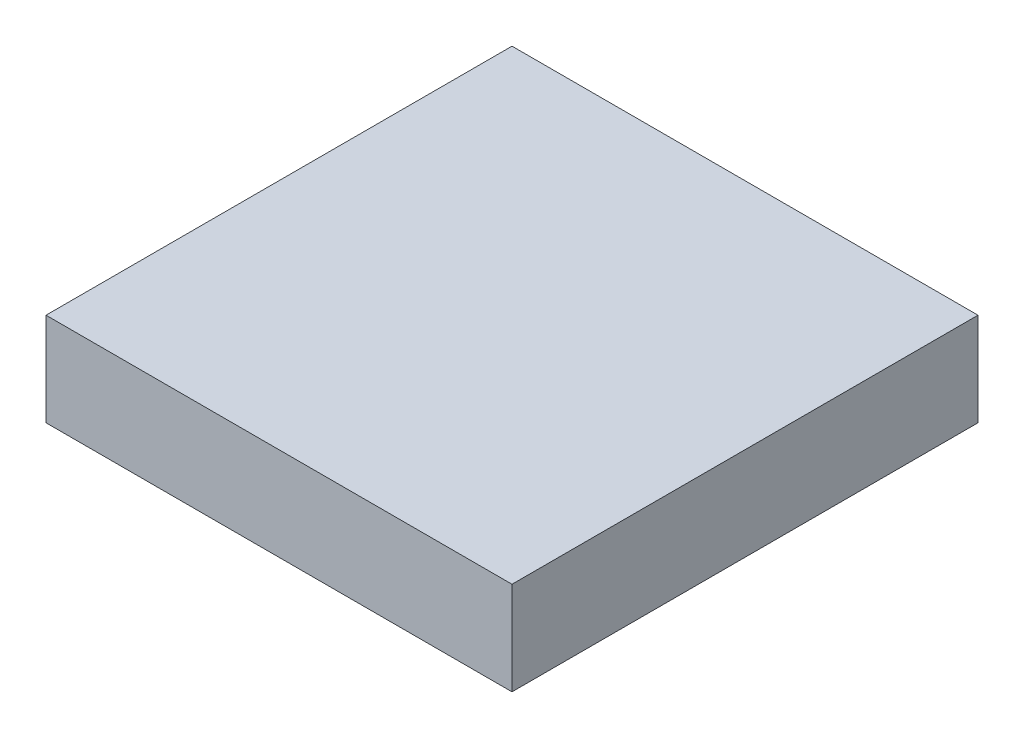
ISO-10303-21;
HEADER;
FILE_DESCRIPTION(('STEP AP214'),'2;1');
FILE_NAME('part.step','',(''),(''),'','','');
FILE_SCHEMA(('AUTOMOTIVE_DESIGN { 1 0 10303 214 1 1 1 1 }'));
ENDSEC;
DATA;
#1=APPLICATION_CONTEXT('core data for automotive mechanical design processes');
#2=APPLICATION_PROTOCOL_DEFINITION('international standard','automotive_design',2000,#1);
#3=PRODUCT_CONTEXT('',#1,'mechanical');
#4=PRODUCT('Part','Part','',(#3));
#5=PRODUCT_RELATED_PRODUCT_CATEGORY('part','',(#4));
#6=PRODUCT_DEFINITION_FORMATION('','',#4);
#7=PRODUCT_DEFINITION_CONTEXT('part definition',#1,'design');
#8=PRODUCT_DEFINITION('design','',#6,#7);
#9=PRODUCT_DEFINITION_SHAPE('','',#8);
#10=(LENGTH_UNIT() NAMED_UNIT(*) SI_UNIT(.MILLI.,.METRE.));
#11=(NAMED_UNIT(*) PLANE_ANGLE_UNIT() SI_UNIT($,.RADIAN.));
#12=(NAMED_UNIT(*) SI_UNIT($,.STERADIAN.) SOLID_ANGLE_UNIT());
#13=UNCERTAINTY_MEASURE_WITH_UNIT(LENGTH_MEASURE(1.E-05),#10,'distance_accuracy_value','');
#14=(GEOMETRIC_REPRESENTATION_CONTEXT(3) GLOBAL_UNCERTAINTY_ASSIGNED_CONTEXT((#13)) GLOBAL_UNIT_ASSIGNED_CONTEXT((#10,
#11,#12)) REPRESENTATION_CONTEXT('',''));
#15=CARTESIAN_POINT('',(0.,0.,0.));
#16=DIRECTION('',(0.,0.,1.));
#17=DIRECTION('',(1.,0.,0.));
#18=AXIS2_PLACEMENT_3D('',#15,#16,#17);
#19=CARTESIAN_POINT('',(10.,4.,10.));
#20=DIRECTION('',(-1.,0.,0.));
#21=DIRECTION('',(0.,0.,1.));
#22=AXIS2_PLACEMENT_3D('',#19,#20,#21);
#23=PLANE('',#22);
#24=DIRECTION('',(0.,0.,-1.));
#25=VECTOR('',#24,1.);
#26=CARTESIAN_POINT('',(10.,0.,10.));
#27=LINE('',#26,#25);
#28=CARTESIAN_POINT('',(10.,0.,10.));
#29=VERTEX_POINT('',#28);
#30=CARTESIAN_POINT('',(10.,0.,-10.));
#31=VERTEX_POINT('',#30);
#32=EDGE_CURVE('E98',#29,#31,#27,.T.);
#33=ORIENTED_EDGE('',*,*,#32,.T.);
#34=DIRECTION('',(0.,-1.,0.));
#35=VECTOR('',#34,1.);
#36=CARTESIAN_POINT('',(10.,4.,-10.));
#37=LINE('',#36,#35);
#38=CARTESIAN_POINT('',(10.,4.,-10.));
#39=VERTEX_POINT('',#38);
#40=EDGE_CURVE('E11',#39,#31,#37,.T.);
#41=ORIENTED_EDGE('',*,*,#40,.F.);
#42=DIRECTION('',(0.,0.,-1.));
#43=VECTOR('',#42,1.);
#44=CARTESIAN_POINT('',(10.,4.,10.));
#45=LINE('',#44,#43);
#46=CARTESIAN_POINT('',(10.,4.,10.));
#47=VERTEX_POINT('',#46);
#48=EDGE_CURVE('E86',#47,#39,#45,.T.);
#49=ORIENTED_EDGE('',*,*,#48,.F.);
#50=DIRECTION('',(0.,-1.,0.));
#51=VECTOR('',#50,1.);
#52=CARTESIAN_POINT('',(10.,4.,10.));
#53=LINE('',#52,#51);
#54=EDGE_CURVE('E94',#47,#29,#53,.T.);
#55=ORIENTED_EDGE('',*,*,#54,.T.);
#56=EDGE_LOOP('',(#33,#41,#49,#55));
#57=FACE_BOUND('',#56,.T.);
#58=ADVANCED_FACE('F35',(#57),#23,.F.);
#59=CARTESIAN_POINT('',(-10.,4.,-10.));
#60=DIRECTION('',(0.,0.,1.));
#61=DIRECTION('',(1.,0.,0.));
#62=AXIS2_PLACEMENT_3D('',#59,#60,#61);
#63=PLANE('',#62);
#64=DIRECTION('',(-1.,0.,0.));
#65=VECTOR('',#64,1.);
#66=CARTESIAN_POINT('',(-10.,0.,-10.));
#67=LINE('',#66,#65);
#68=CARTESIAN_POINT('',(-10.,0.,-10.));
#69=VERTEX_POINT('',#68);
#70=EDGE_CURVE('E90',#31,#69,#67,.T.);
#71=ORIENTED_EDGE('',*,*,#70,.T.);
#72=DIRECTION('',(0.,-1.,0.));
#73=VECTOR('',#72,1.);
#74=CARTESIAN_POINT('',(-10.,4.,-10.));
#75=LINE('',#74,#73);
#76=CARTESIAN_POINT('',(-10.,4.,-10.));
#77=VERTEX_POINT('',#76);
#78=EDGE_CURVE('E43',#77,#69,#75,.T.);
#79=ORIENTED_EDGE('',*,*,#78,.F.);
#80=DIRECTION('',(-1.,0.,0.));
#81=VECTOR('',#80,1.);
#82=CARTESIAN_POINT('',(-10.,4.,-10.));
#83=LINE('',#82,#81);
#84=EDGE_CURVE('E81',#39,#77,#83,.T.);
#85=ORIENTED_EDGE('',*,*,#84,.F.);
#86=ORIENTED_EDGE('',*,*,#40,.T.);
#87=EDGE_LOOP('',(#71,#79,#85,#86));
#88=FACE_BOUND('',#87,.T.);
#89=ADVANCED_FACE('F89',(#88),#63,.F.);
#90=CARTESIAN_POINT('',(-10.,4.,10.));
#91=DIRECTION('',(1.,0.,0.));
#92=DIRECTION('',(0.,0.,-1.));
#93=AXIS2_PLACEMENT_3D('',#90,#91,#92);
#94=PLANE('',#93);
#95=DIRECTION('',(0.,0.,1.));
#96=VECTOR('',#95,1.);
#97=CARTESIAN_POINT('',(-10.,0.,10.));
#98=LINE('',#97,#96);
#99=CARTESIAN_POINT('',(-10.,0.,10.));
#100=VERTEX_POINT('',#99);
#101=EDGE_CURVE('E68',#69,#100,#98,.T.);
#102=ORIENTED_EDGE('',*,*,#101,.T.);
#103=DIRECTION('',(0.,-1.,0.));
#104=VECTOR('',#103,1.);
#105=CARTESIAN_POINT('',(-10.,4.,10.));
#106=LINE('',#105,#104);
#107=CARTESIAN_POINT('',(-10.,4.,10.));
#108=VERTEX_POINT('',#107);
#109=EDGE_CURVE('E91',#108,#100,#106,.T.);
#110=ORIENTED_EDGE('',*,*,#109,.F.);
#111=DIRECTION('',(0.,0.,1.));
#112=VECTOR('',#111,1.);
#113=CARTESIAN_POINT('',(-10.,4.,10.));
#114=LINE('',#113,#112);
#115=EDGE_CURVE('E84',#77,#108,#114,.T.);
#116=ORIENTED_EDGE('',*,*,#115,.F.);
#117=ORIENTED_EDGE('',*,*,#78,.T.);
#118=EDGE_LOOP('',(#102,#110,#116,#117));
#119=FACE_BOUND('',#118,.T.);
#120=ADVANCED_FACE('F92',(#119),#94,.F.);
#121=CARTESIAN_POINT('',(-10.,4.,10.));
#122=DIRECTION('',(0.,0.,-1.));
#123=DIRECTION('',(-1.,0.,0.));
#124=AXIS2_PLACEMENT_3D('',#121,#122,#123);
#125=PLANE('',#124);
#126=DIRECTION('',(1.,0.,0.));
#127=VECTOR('',#126,1.);
#128=CARTESIAN_POINT('',(-10.,0.,10.));
#129=LINE('',#128,#127);
#130=EDGE_CURVE('E74',#100,#29,#129,.T.);
#131=ORIENTED_EDGE('',*,*,#130,.T.);
#132=ORIENTED_EDGE('',*,*,#54,.F.);
#133=DIRECTION('',(1.,0.,0.));
#134=VECTOR('',#133,1.);
#135=CARTESIAN_POINT('',(-10.,4.,10.));
#136=LINE('',#135,#134);
#137=EDGE_CURVE('E51',#108,#47,#136,.T.);
#138=ORIENTED_EDGE('',*,*,#137,.F.);
#139=ORIENTED_EDGE('',*,*,#109,.T.);
#140=EDGE_LOOP('',(#131,#132,#138,#139));
#141=FACE_BOUND('',#140,.T.);
#142=ADVANCED_FACE('F105',(#141),#125,.F.);
#143=CARTESIAN_POINT('',(0.,4.,0.));
#144=DIRECTION('',(0.,-1.,0.));
#145=DIRECTION('',(0.,0.,-1.));
#146=AXIS2_PLACEMENT_3D('',#143,#144,#145);
#147=PLANE('',#146);
#148=ORIENTED_EDGE('',*,*,#48,.T.);
#149=ORIENTED_EDGE('',*,*,#84,.T.);
#150=ORIENTED_EDGE('',*,*,#115,.T.);
#151=ORIENTED_EDGE('',*,*,#137,.T.);
#152=EDGE_LOOP('',(#148,#149,#150,#151));
#153=FACE_BOUND('',#152,.T.);
#154=ADVANCED_FACE('F82',(#153),#147,.F.);
#155=CARTESIAN_POINT('',(0.,0.,0.));
#156=DIRECTION('',(0.,-1.,0.));
#157=DIRECTION('',(0.,0.,-1.));
#158=AXIS2_PLACEMENT_3D('',#155,#156,#157);
#159=PLANE('',#158);
#160=ORIENTED_EDGE('',*,*,#32,.F.);
#161=ORIENTED_EDGE('',*,*,#130,.F.);
#162=ORIENTED_EDGE('',*,*,#101,.F.);
#163=ORIENTED_EDGE('',*,*,#70,.F.);
#164=EDGE_LOOP('',(#160,#161,#162,#163));
#165=FACE_BOUND('',#164,.T.);
#166=ADVANCED_FACE('F108',(#165),#159,.T.);
#167=CLOSED_SHELL('',(#58,#89,#120,#142,#154,#166));
#168=MANIFOLD_SOLID_BREP('B2',#167);
#169=ADVANCED_BREP_SHAPE_REPRESENTATION('',(#18,#168),#14);
#170=SHAPE_DEFINITION_REPRESENTATION(#9,#169);
ENDSEC;
END-ISO-10303-21;
